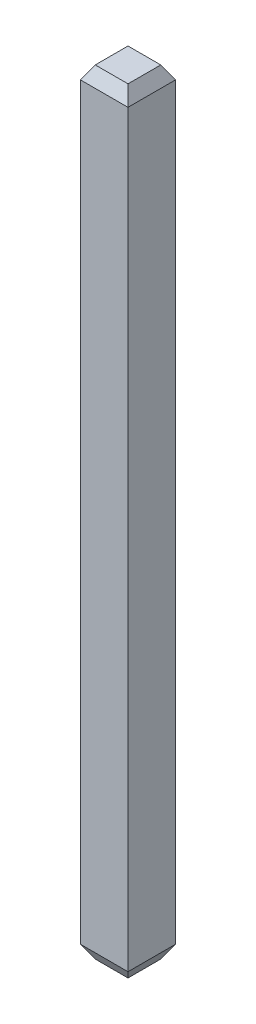
ISO-10303-21;
HEADER;
FILE_DESCRIPTION(('STEP AP214'),'2;1');
FILE_NAME('part.step','',(''),(''),'','','');
FILE_SCHEMA(('AUTOMOTIVE_DESIGN { 1 0 10303 214 1 1 1 1 }'));
ENDSEC;
DATA;
#1=APPLICATION_CONTEXT('core data for automotive mechanical design processes');
#2=APPLICATION_PROTOCOL_DEFINITION('international standard','automotive_design',2000,#1);
#3=PRODUCT_CONTEXT('',#1,'mechanical');
#4=PRODUCT('Part','Part','',(#3));
#5=PRODUCT_RELATED_PRODUCT_CATEGORY('part','',(#4));
#6=PRODUCT_DEFINITION_FORMATION('','',#4);
#7=PRODUCT_DEFINITION_CONTEXT('part definition',#1,'design');
#8=PRODUCT_DEFINITION('design','',#6,#7);
#9=PRODUCT_DEFINITION_SHAPE('','',#8);
#10=(LENGTH_UNIT() NAMED_UNIT(*) SI_UNIT(.MILLI.,.METRE.));
#11=(NAMED_UNIT(*) PLANE_ANGLE_UNIT() SI_UNIT($,.RADIAN.));
#12=(NAMED_UNIT(*) SI_UNIT($,.STERADIAN.) SOLID_ANGLE_UNIT());
#13=UNCERTAINTY_MEASURE_WITH_UNIT(LENGTH_MEASURE(1.E-05),#10,'distance_accuracy_value','');
#14=(GEOMETRIC_REPRESENTATION_CONTEXT(3) GLOBAL_UNCERTAINTY_ASSIGNED_CONTEXT((#13)) GLOBAL_UNIT_ASSIGNED_CONTEXT((#10,
#11,#12)) REPRESENTATION_CONTEXT('',''));
#15=CARTESIAN_POINT('',(0.,0.,0.));
#16=DIRECTION('',(0.,0.,1.));
#17=DIRECTION('',(1.,0.,0.));
#18=AXIS2_PLACEMENT_3D('',#15,#16,#17);
#19=CARTESIAN_POINT('',(0.32,10.4,-0.32));
#20=DIRECTION('',(-1.,0.,0.));
#21=DIRECTION('',(0.,0.,1.));
#22=AXIS2_PLACEMENT_3D('',#19,#20,#21);
#23=PLANE('',#22);
#24=DIRECTION('',(0.,-1.,0.));
#25=VECTOR('',#24,1.);
#26=CARTESIAN_POINT('',(0.32,10.4,0.32));
#27=LINE('',#26,#25);
#28=CARTESIAN_POINT('',(0.32,10.2267949192431,0.32));
#29=VERTEX_POINT('',#28);
#30=CARTESIAN_POINT('',(0.32,0.173205080756886,0.32));
#31=VERTEX_POINT('',#30);
#32=EDGE_CURVE('E11',#29,#31,#27,.T.);
#33=ORIENTED_EDGE('',*,*,#32,.T.);
#34=DIRECTION('',(0.,0.,-1.));
#35=VECTOR('',#34,1.);
#36=CARTESIAN_POINT('',(0.32,0.173205080756886,-0.32));
#37=LINE('',#36,#35);
#38=CARTESIAN_POINT('',(0.32,0.173205080756886,-0.32));
#39=VERTEX_POINT('',#38);
#40=EDGE_CURVE('E24',#31,#39,#37,.T.);
#41=ORIENTED_EDGE('',*,*,#40,.T.);
#42=DIRECTION('',(0.,-1.,0.));
#43=VECTOR('',#42,1.);
#44=CARTESIAN_POINT('',(0.32,10.4,-0.32));
#45=LINE('',#44,#43);
#46=CARTESIAN_POINT('',(0.32,10.2267949192431,-0.32));
#47=VERTEX_POINT('',#46);
#48=EDGE_CURVE('E140',#47,#39,#45,.T.);
#49=ORIENTED_EDGE('',*,*,#48,.F.);
#50=DIRECTION('',(0.,0.,1.));
#51=VECTOR('',#50,1.);
#52=CARTESIAN_POINT('',(0.32,10.2267949192431,0.32));
#53=LINE('',#52,#51);
#54=EDGE_CURVE('E138',#47,#29,#53,.T.);
#55=ORIENTED_EDGE('',*,*,#54,.T.);
#56=EDGE_LOOP('',(#33,#41,#49,#55));
#57=FACE_BOUND('',#56,.T.);
#58=ADVANCED_FACE('F17',(#57),#23,.F.);
#59=CARTESIAN_POINT('',(-0.32,10.4,-0.32));
#60=DIRECTION('',(0.,0.,1.));
#61=DIRECTION('',(1.,0.,0.));
#62=AXIS2_PLACEMENT_3D('',#59,#60,#61);
#63=PLANE('',#62);
#64=ORIENTED_EDGE('',*,*,#48,.T.);
#65=DIRECTION('',(-1.,0.,0.));
#66=VECTOR('',#65,1.);
#67=CARTESIAN_POINT('',(-0.32,0.173205080756886,-0.32));
#68=LINE('',#67,#66);
#69=CARTESIAN_POINT('',(-0.32,0.173205080756886,-0.32));
#70=VERTEX_POINT('',#69);
#71=EDGE_CURVE('E136',#39,#70,#68,.T.);
#72=ORIENTED_EDGE('',*,*,#71,.T.);
#73=DIRECTION('',(0.,-1.,0.));
#74=VECTOR('',#73,1.);
#75=CARTESIAN_POINT('',(-0.32,10.4,-0.32));
#76=LINE('',#75,#74);
#77=CARTESIAN_POINT('',(-0.32,10.2267949192431,-0.32));
#78=VERTEX_POINT('',#77);
#79=EDGE_CURVE('E133',#78,#70,#76,.T.);
#80=ORIENTED_EDGE('',*,*,#79,.F.);
#81=DIRECTION('',(1.,0.,0.));
#82=VECTOR('',#81,1.);
#83=CARTESIAN_POINT('',(0.32,10.2267949192431,-0.32));
#84=LINE('',#83,#82);
#85=EDGE_CURVE('E130',#78,#47,#84,.T.);
#86=ORIENTED_EDGE('',*,*,#85,.T.);
#87=EDGE_LOOP('',(#64,#72,#80,#86));
#88=FACE_BOUND('',#87,.T.);
#89=ADVANCED_FACE('F145',(#88),#63,.F.);
#90=CARTESIAN_POINT('',(-0.32,10.4,-0.32));
#91=DIRECTION('',(1.,0.,0.));
#92=DIRECTION('',(0.,0.,-1.));
#93=AXIS2_PLACEMENT_3D('',#90,#91,#92);
#94=PLANE('',#93);
#95=ORIENTED_EDGE('',*,*,#79,.T.);
#96=DIRECTION('',(0.,0.,1.));
#97=VECTOR('',#96,1.);
#98=CARTESIAN_POINT('',(-0.32,0.173205080756886,-0.32));
#99=LINE('',#98,#97);
#100=CARTESIAN_POINT('',(-0.32,0.173205080756886,0.32));
#101=VERTEX_POINT('',#100);
#102=EDGE_CURVE('E128',#70,#101,#99,.T.);
#103=ORIENTED_EDGE('',*,*,#102,.T.);
#104=DIRECTION('',(0.,-1.,0.));
#105=VECTOR('',#104,1.);
#106=CARTESIAN_POINT('',(-0.32,10.4,0.32));
#107=LINE('',#106,#105);
#108=CARTESIAN_POINT('',(-0.32,10.2267949192431,0.32));
#109=VERTEX_POINT('',#108);
#110=EDGE_CURVE('E125',#109,#101,#107,.T.);
#111=ORIENTED_EDGE('',*,*,#110,.F.);
#112=DIRECTION('',(0.,0.,-1.));
#113=VECTOR('',#112,1.);
#114=CARTESIAN_POINT('',(-0.32,10.2267949192431,-0.32));
#115=LINE('',#114,#113);
#116=EDGE_CURVE('E122',#109,#78,#115,.T.);
#117=ORIENTED_EDGE('',*,*,#116,.T.);
#118=EDGE_LOOP('',(#95,#103,#111,#117));
#119=FACE_BOUND('',#118,.T.);
#120=ADVANCED_FACE('F187',(#119),#94,.F.);
#121=CARTESIAN_POINT('',(-0.32,10.4,0.32));
#122=DIRECTION('',(0.,0.,-1.));
#123=DIRECTION('',(-1.,0.,0.));
#124=AXIS2_PLACEMENT_3D('',#121,#122,#123);
#125=PLANE('',#124);
#126=ORIENTED_EDGE('',*,*,#110,.T.);
#127=DIRECTION('',(1.,0.,0.));
#128=VECTOR('',#127,1.);
#129=CARTESIAN_POINT('',(-0.32,0.173205080756886,0.32));
#130=LINE('',#129,#128);
#131=EDGE_CURVE('E120',#101,#31,#130,.T.);
#132=ORIENTED_EDGE('',*,*,#131,.T.);
#133=ORIENTED_EDGE('',*,*,#32,.F.);
#134=DIRECTION('',(-1.,0.,0.));
#135=VECTOR('',#134,1.);
#136=CARTESIAN_POINT('',(-0.32,10.2267949192431,0.32));
#137=LINE('',#136,#135);
#138=EDGE_CURVE('E118',#29,#109,#137,.T.);
#139=ORIENTED_EDGE('',*,*,#138,.T.);
#140=EDGE_LOOP('',(#126,#132,#133,#139));
#141=FACE_BOUND('',#140,.T.);
#142=ADVANCED_FACE('F185',(#141),#125,.F.);
#143=CARTESIAN_POINT('',(0.32,10.4,0.32));
#144=DIRECTION('',(0.,1.,0.));
#145=DIRECTION('',(0.,0.,1.));
#146=AXIS2_PLACEMENT_3D('',#143,#144,#145);
#147=PLANE('',#146);
#148=DIRECTION('',(0.,0.,1.));
#149=VECTOR('',#148,1.);
#150=CARTESIAN_POINT('',(-0.22,10.4,0.32));
#151=LINE('',#150,#149);
#152=CARTESIAN_POINT('',(-0.22,10.4,-0.22));
#153=VERTEX_POINT('',#152);
#154=CARTESIAN_POINT('',(-0.22,10.4,0.22));
#155=VERTEX_POINT('',#154);
#156=EDGE_CURVE('E116',#153,#155,#151,.T.);
#157=ORIENTED_EDGE('',*,*,#156,.T.);
#158=DIRECTION('',(1.,0.,0.));
#159=VECTOR('',#158,1.);
#160=CARTESIAN_POINT('',(0.32,10.4,0.22));
#161=LINE('',#160,#159);
#162=CARTESIAN_POINT('',(0.22,10.4,0.22));
#163=VERTEX_POINT('',#162);
#164=EDGE_CURVE('E114',#155,#163,#161,.T.);
#165=ORIENTED_EDGE('',*,*,#164,.T.);
#166=DIRECTION('',(0.,0.,-1.));
#167=VECTOR('',#166,1.);
#168=CARTESIAN_POINT('',(0.22,10.4,-0.32));
#169=LINE('',#168,#167);
#170=CARTESIAN_POINT('',(0.22,10.4,-0.22));
#171=VERTEX_POINT('',#170);
#172=EDGE_CURVE('E112',#163,#171,#169,.T.);
#173=ORIENTED_EDGE('',*,*,#172,.T.);
#174=DIRECTION('',(-1.,0.,0.));
#175=VECTOR('',#174,1.);
#176=CARTESIAN_POINT('',(-0.32,10.4,-0.22));
#177=LINE('',#176,#175);
#178=EDGE_CURVE('E109',#171,#153,#177,.T.);
#179=ORIENTED_EDGE('',*,*,#178,.T.);
#180=EDGE_LOOP('',(#157,#165,#173,#179));
#181=FACE_BOUND('',#180,.T.);
#182=ADVANCED_FACE('F177',(#181),#147,.T.);
#183=CARTESIAN_POINT('',(0.32,0.,0.32));
#184=DIRECTION('',(0.,1.,0.));
#185=DIRECTION('',(0.,0.,1.));
#186=AXIS2_PLACEMENT_3D('',#183,#184,#185);
#187=PLANE('',#186);
#188=DIRECTION('',(0.,0.,-1.));
#189=VECTOR('',#188,1.);
#190=CARTESIAN_POINT('',(-0.22,0.,0.32));
#191=LINE('',#190,#189);
#192=CARTESIAN_POINT('',(-0.22,0.,0.22));
#193=VERTEX_POINT('',#192);
#194=CARTESIAN_POINT('',(-0.22,0.,-0.22));
#195=VERTEX_POINT('',#194);
#196=EDGE_CURVE('E107',#193,#195,#191,.T.);
#197=ORIENTED_EDGE('',*,*,#196,.T.);
#198=DIRECTION('',(1.,0.,0.));
#199=VECTOR('',#198,1.);
#200=CARTESIAN_POINT('',(0.32,0.,-0.22));
#201=LINE('',#200,#199);
#202=CARTESIAN_POINT('',(0.22,0.,-0.22));
#203=VERTEX_POINT('',#202);
#204=EDGE_CURVE('E84',#195,#203,#201,.T.);
#205=ORIENTED_EDGE('',*,*,#204,.T.);
#206=DIRECTION('',(0.,0.,1.));
#207=VECTOR('',#206,1.);
#208=CARTESIAN_POINT('',(0.22,0.,0.32));
#209=LINE('',#208,#207);
#210=CARTESIAN_POINT('',(0.22,0.,0.22));
#211=VERTEX_POINT('',#210);
#212=EDGE_CURVE('E78',#203,#211,#209,.T.);
#213=ORIENTED_EDGE('',*,*,#212,.T.);
#214=DIRECTION('',(-1.,0.,0.));
#215=VECTOR('',#214,1.);
#216=CARTESIAN_POINT('',(0.32,0.,0.22));
#217=LINE('',#216,#215);
#218=EDGE_CURVE('E81',#211,#193,#217,.T.);
#219=ORIENTED_EDGE('',*,*,#218,.T.);
#220=EDGE_LOOP('',(#197,#205,#213,#219));
#221=FACE_BOUND('',#220,.T.);
#222=ADVANCED_FACE('F80',(#221),#187,.F.);
#223=CARTESIAN_POINT('',(-0.32,0.173205080756886,0.32));
#224=DIRECTION('',(0.,0.500000000000004,-0.866025403784436));
#225=DIRECTION('',(0.,0.866025403784436,0.500000000000004));
#226=AXIS2_PLACEMENT_3D('',#223,#224,#225);
#227=PLANE('',#226);
#228=DIRECTION('',(-0.447213595499961,0.77459666924148,0.447213595499961));
#229=VECTOR('',#228,1.);
#230=CARTESIAN_POINT('',(-0.32,0.173205080756886,0.32));
#231=LINE('',#230,#229);
#232=EDGE_CURVE('E96',#193,#101,#231,.T.);
#233=ORIENTED_EDGE('',*,*,#232,.F.);
#234=ORIENTED_EDGE('',*,*,#218,.F.);
#235=DIRECTION('',(-0.447213595499961,-0.77459666924148,-0.447213595499961));
#236=VECTOR('',#235,1.);
#237=CARTESIAN_POINT('',(0.191999999999998,-0.0484974226119303,0.191999999999998));
#238=LINE('',#237,#236);
#239=EDGE_CURVE('E94',#31,#211,#238,.T.);
#240=ORIENTED_EDGE('',*,*,#239,.F.);
#241=ORIENTED_EDGE('',*,*,#131,.F.);
#242=EDGE_LOOP('',(#233,#234,#240,#241));
#243=FACE_BOUND('',#242,.T.);
#244=ADVANCED_FACE('F92',(#243),#227,.F.);
#245=CARTESIAN_POINT('',(0.32,0.173205080756886,-0.32));
#246=DIRECTION('',(-0.866025403784436,0.500000000000004,0.));
#247=DIRECTION('',(-0.500000000000004,-0.866025403784436,0.));
#248=AXIS2_PLACEMENT_3D('',#245,#246,#247);
#249=PLANE('',#248);
#250=ORIENTED_EDGE('',*,*,#239,.T.);
#251=ORIENTED_EDGE('',*,*,#212,.F.);
#252=DIRECTION('',(-0.447213595499961,-0.77459666924148,0.447213595499961));
#253=VECTOR('',#252,1.);
#254=CARTESIAN_POINT('',(0.32,0.173205080756886,-0.32));
#255=LINE('',#254,#253);
#256=EDGE_CURVE('E99',#39,#203,#255,.T.);
#257=ORIENTED_EDGE('',*,*,#256,.F.);
#258=ORIENTED_EDGE('',*,*,#40,.F.);
#259=EDGE_LOOP('',(#250,#251,#257,#258));
#260=FACE_BOUND('',#259,.T.);
#261=ADVANCED_FACE('F98',(#260),#249,.F.);
#262=CARTESIAN_POINT('',(-0.32,0.173205080756886,-0.32));
#263=DIRECTION('',(0.866025403784436,0.500000000000004,0.));
#264=DIRECTION('',(-0.500000000000004,0.866025403784436,0.));
#265=AXIS2_PLACEMENT_3D('',#262,#263,#264);
#266=PLANE('',#265);
#267=ORIENTED_EDGE('',*,*,#232,.T.);
#268=ORIENTED_EDGE('',*,*,#102,.F.);
#269=DIRECTION('',(-0.447213595499961,0.77459666924148,-0.447213595499961));
#270=VECTOR('',#269,1.);
#271=CARTESIAN_POINT('',(-0.32,0.173205080756886,-0.32));
#272=LINE('',#271,#270);
#273=EDGE_CURVE('E102',#195,#70,#272,.T.);
#274=ORIENTED_EDGE('',*,*,#273,.F.);
#275=ORIENTED_EDGE('',*,*,#196,.F.);
#276=EDGE_LOOP('',(#267,#268,#274,#275));
#277=FACE_BOUND('',#276,.T.);
#278=ADVANCED_FACE('F186',(#277),#266,.F.);
#279=CARTESIAN_POINT('',(-0.32,0.173205080756886,-0.32));
#280=DIRECTION('',(0.,0.500000000000004,0.866025403784436));
#281=DIRECTION('',(0.,-0.866025403784436,0.500000000000004));
#282=AXIS2_PLACEMENT_3D('',#279,#280,#281);
#283=PLANE('',#282);
#284=ORIENTED_EDGE('',*,*,#256,.T.);
#285=ORIENTED_EDGE('',*,*,#204,.F.);
#286=ORIENTED_EDGE('',*,*,#273,.T.);
#287=ORIENTED_EDGE('',*,*,#71,.F.);
#288=EDGE_LOOP('',(#284,#285,#286,#287));
#289=FACE_BOUND('',#288,.T.);
#290=ADVANCED_FACE('F150',(#289),#283,.F.);
#291=CARTESIAN_POINT('',(0.32,10.4,-0.22));
#292=DIRECTION('',(0.,0.499999999999996,-0.866025403784441));
#293=DIRECTION('',(0.,0.866025403784441,0.499999999999996));
#294=AXIS2_PLACEMENT_3D('',#291,#292,#293);
#295=PLANE('',#294);
#296=DIRECTION('',(-0.447213595499955,0.774596669241487,0.447213595499955));
#297=VECTOR('',#296,1.);
#298=CARTESIAN_POINT('',(0.112000000000001,10.5870614872174,-0.112000000000001));
#299=LINE('',#298,#297);
#300=EDGE_CURVE('E154',#47,#171,#299,.T.);
#301=ORIENTED_EDGE('',*,*,#300,.F.);
#302=ORIENTED_EDGE('',*,*,#85,.F.);
#303=DIRECTION('',(-0.447213595499955,-0.774596669241487,-0.447213595499955));
#304=VECTOR('',#303,1.);
#305=CARTESIAN_POINT('',(-0.112000000000001,10.5870614872174,-0.112000000000001));
#306=LINE('',#305,#304);
#307=EDGE_CURVE('E156',#153,#78,#306,.T.);
#308=ORIENTED_EDGE('',*,*,#307,.F.);
#309=ORIENTED_EDGE('',*,*,#178,.F.);
#310=EDGE_LOOP('',(#301,#302,#308,#309));
#311=FACE_BOUND('',#310,.T.);
#312=ADVANCED_FACE('F180',(#311),#295,.T.);
#313=CARTESIAN_POINT('',(-0.22,10.4,0.32));
#314=DIRECTION('',(-0.866025403784441,0.499999999999996,0.));
#315=DIRECTION('',(-0.499999999999996,-0.866025403784441,0.));
#316=AXIS2_PLACEMENT_3D('',#313,#314,#315);
#317=PLANE('',#316);
#318=ORIENTED_EDGE('',*,*,#307,.T.);
#319=ORIENTED_EDGE('',*,*,#116,.F.);
#320=DIRECTION('',(-0.447213595499955,-0.774596669241487,0.447213595499955));
#321=VECTOR('',#320,1.);
#322=CARTESIAN_POINT('',(-0.24,10.3653589838486,0.24));
#323=LINE('',#322,#321);
#324=EDGE_CURVE('E161',#155,#109,#323,.T.);
#325=ORIENTED_EDGE('',*,*,#324,.F.);
#326=ORIENTED_EDGE('',*,*,#156,.F.);
#327=EDGE_LOOP('',(#318,#319,#325,#326));
#328=FACE_BOUND('',#327,.T.);
#329=ADVANCED_FACE('F183',(#328),#317,.T.);
#330=CARTESIAN_POINT('',(0.22,10.4,0.32));
#331=DIRECTION('',(0.866025403784441,0.499999999999996,0.));
#332=DIRECTION('',(-0.499999999999996,0.866025403784441,0.));
#333=AXIS2_PLACEMENT_3D('',#330,#331,#332);
#334=PLANE('',#333);
#335=ORIENTED_EDGE('',*,*,#300,.T.);
#336=ORIENTED_EDGE('',*,*,#172,.F.);
#337=DIRECTION('',(-0.447213595499955,0.774596669241487,-0.447213595499955));
#338=VECTOR('',#337,1.);
#339=CARTESIAN_POINT('',(0.24,10.3653589838486,0.24));
#340=LINE('',#339,#338);
#341=EDGE_CURVE('E164',#29,#163,#340,.T.);
#342=ORIENTED_EDGE('',*,*,#341,.F.);
#343=ORIENTED_EDGE('',*,*,#54,.F.);
#344=EDGE_LOOP('',(#335,#336,#342,#343));
#345=FACE_BOUND('',#344,.T.);
#346=ADVANCED_FACE('F174',(#345),#334,.T.);
#347=CARTESIAN_POINT('',(0.32,10.4,0.22));
#348=DIRECTION('',(0.,0.499999999999996,0.866025403784441));
#349=DIRECTION('',(0.,-0.866025403784441,0.499999999999996));
#350=AXIS2_PLACEMENT_3D('',#347,#348,#349);
#351=PLANE('',#350);
#352=ORIENTED_EDGE('',*,*,#324,.T.);
#353=ORIENTED_EDGE('',*,*,#138,.F.);
#354=ORIENTED_EDGE('',*,*,#341,.T.);
#355=ORIENTED_EDGE('',*,*,#164,.F.);
#356=EDGE_LOOP('',(#352,#353,#354,#355));
#357=FACE_BOUND('',#356,.T.);
#358=ADVANCED_FACE('F170',(#357),#351,.T.);
#359=CLOSED_SHELL('',(#58,#89,#120,#142,#182,#222,#244,#261,#278,#290,#312,#329,#346,#358));
#360=MANIFOLD_SOLID_BREP('B1',#359);
#361=ADVANCED_BREP_SHAPE_REPRESENTATION('',(#18,#360),#14);
#362=SHAPE_DEFINITION_REPRESENTATION(#9,#361);
ENDSEC;
END-ISO-10303-21;
